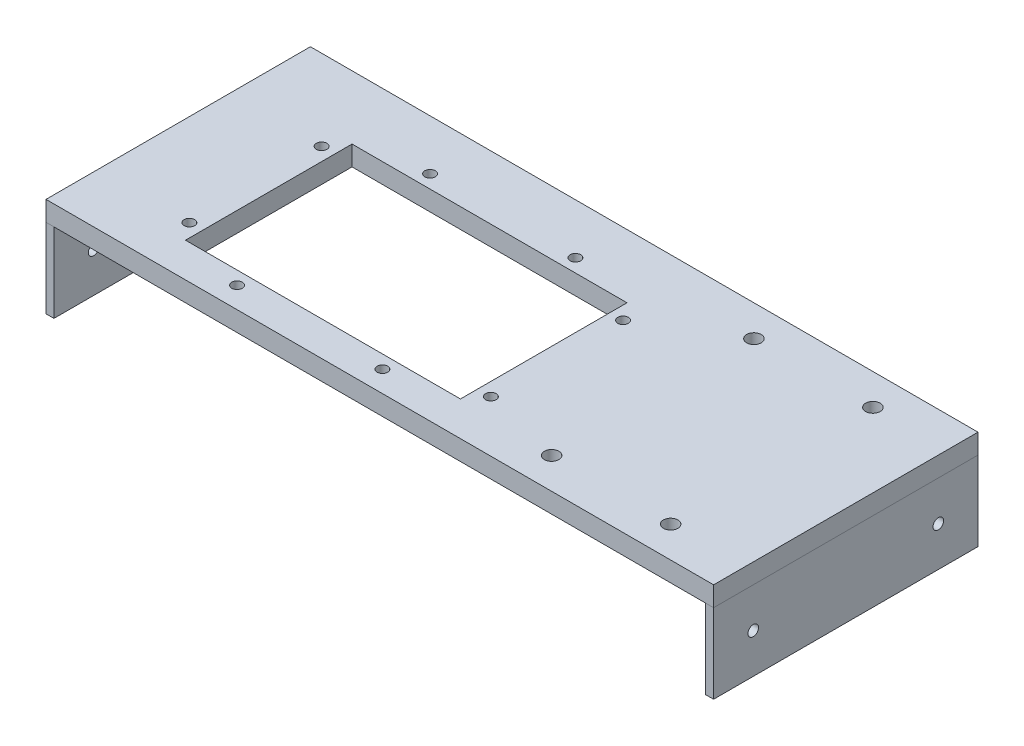
ISO-10303-21;
HEADER;
FILE_DESCRIPTION(('STEP AP214'),'2;1');
FILE_NAME('part.step','',(''),(''),'','','');
FILE_SCHEMA(('AUTOMOTIVE_DESIGN { 1 0 10303 214 1 1 1 1 }'));
ENDSEC;
DATA;
#1=APPLICATION_CONTEXT('core data for automotive mechanical design processes');
#2=APPLICATION_PROTOCOL_DEFINITION('international standard','automotive_design',2000,#1);
#3=PRODUCT_CONTEXT('',#1,'mechanical');
#4=PRODUCT('Part','Part','',(#3));
#5=PRODUCT_RELATED_PRODUCT_CATEGORY('part','',(#4));
#6=PRODUCT_DEFINITION_FORMATION('','',#4);
#7=PRODUCT_DEFINITION_CONTEXT('part definition',#1,'design');
#8=PRODUCT_DEFINITION('design','',#6,#7);
#9=PRODUCT_DEFINITION_SHAPE('','',#8);
#10=(LENGTH_UNIT() NAMED_UNIT(*) SI_UNIT(.MILLI.,.METRE.));
#11=(NAMED_UNIT(*) PLANE_ANGLE_UNIT() SI_UNIT($,.RADIAN.));
#12=(NAMED_UNIT(*) SI_UNIT($,.STERADIAN.) SOLID_ANGLE_UNIT());
#13=UNCERTAINTY_MEASURE_WITH_UNIT(LENGTH_MEASURE(1.E-05),#10,'distance_accuracy_value','');
#14=(GEOMETRIC_REPRESENTATION_CONTEXT(3) GLOBAL_UNCERTAINTY_ASSIGNED_CONTEXT((#13)) GLOBAL_UNIT_ASSIGNED_CONTEXT((#10,
#11,#12)) REPRESENTATION_CONTEXT('',''));
#15=CARTESIAN_POINT('',(0.,0.,0.));
#16=DIRECTION('',(0.,0.,1.));
#17=DIRECTION('',(1.,0.,0.));
#18=AXIS2_PLACEMENT_3D('',#15,#16,#17);
#19=CARTESIAN_POINT('',(252.5,-14.9999999999999,-100.000000000001));
#20=DIRECTION('',(0.,1.,0.));
#21=DIRECTION('',(-1.,0.,0.));
#22=AXIS2_PLACEMENT_3D('',#19,#20,#21);
#23=PLANE('',#22);
#24=DIRECTION('',(-1.,0.,0.));
#25=VECTOR('',#24,1.);
#26=CARTESIAN_POINT('',(252.5,-14.9999999999999,100.000000000001));
#27=LINE('',#26,#25);
#28=CARTESIAN_POINT('',(252.5,-14.9999999999999,100.000000000001));
#29=VERTEX_POINT('',#28);
#30=CARTESIAN_POINT('',(246.5,-14.9999999999999,100.000000000001));
#31=VERTEX_POINT('',#30);
#32=EDGE_CURVE('E114',#29,#31,#27,.T.);
#33=ORIENTED_EDGE('',*,*,#32,.F.);
#34=DIRECTION('',(0.,0.,1.));
#35=VECTOR('',#34,1.);
#36=CARTESIAN_POINT('',(252.5,-14.9999999999999,-100.000000000001));
#37=LINE('',#36,#35);
#38=CARTESIAN_POINT('',(252.5,-14.9999999999999,-100.000000000001));
#39=VERTEX_POINT('',#38);
#40=EDGE_CURVE('E12',#39,#29,#37,.T.);
#41=ORIENTED_EDGE('',*,*,#40,.F.);
#42=DIRECTION('',(-1.,0.,0.));
#43=VECTOR('',#42,1.);
#44=CARTESIAN_POINT('',(252.5,-14.9999999999999,-100.000000000001));
#45=LINE('',#44,#43);
#46=CARTESIAN_POINT('',(246.5,-14.9999999999999,-100.000000000001));
#47=VERTEX_POINT('',#46);
#48=EDGE_CURVE('E107',#39,#47,#45,.T.);
#49=ORIENTED_EDGE('',*,*,#48,.T.);
#50=DIRECTION('',(0.,0.,1.));
#51=VECTOR('',#50,1.);
#52=CARTESIAN_POINT('',(246.5,-14.9999999999999,-100.000000000001));
#53=LINE('',#52,#51);
#54=EDGE_CURVE('E90',#47,#31,#53,.T.);
#55=ORIENTED_EDGE('',*,*,#54,.T.);
#56=EDGE_LOOP('',(#33,#41,#49,#55));
#57=FACE_BOUND('',#56,.T.);
#58=ADVANCED_FACE('F47',(#57),#23,.T.);
#59=CARTESIAN_POINT('',(252.5,-14.9999999999999,-100.000000000001));
#60=DIRECTION('',(1.,0.,0.));
#61=DIRECTION('',(0.,0.,-1.));
#62=AXIS2_PLACEMENT_3D('',#59,#60,#61);
#63=PLANE('',#62);
#64=CARTESIAN_POINT('',(252.5,-45.,70.0000000000006));
#65=DIRECTION('',(-1.,0.,0.));
#66=DIRECTION('',(0.,0.,1.));
#67=AXIS2_PLACEMENT_3D('',#64,#65,#66);
#68=CIRCLE('',#67,4.00000000000001);
#69=CARTESIAN_POINT('',(252.5,-45.,74.0000000000007));
#70=VERTEX_POINT('',#69);
#71=EDGE_CURVE('E125',#70,#70,#68,.T.);
#72=ORIENTED_EDGE('',*,*,#71,.T.);
#73=EDGE_LOOP('',(#72));
#74=FACE_BOUND('',#73,.T.);
#75=CARTESIAN_POINT('',(252.5,-45.,-70.0000000000006));
#76=DIRECTION('',(-1.,0.,0.));
#77=DIRECTION('',(0.,0.,-1.));
#78=AXIS2_PLACEMENT_3D('',#75,#76,#77);
#79=CIRCLE('',#78,4.00000000000001);
#80=CARTESIAN_POINT('',(252.5,-45.,-74.0000000000007));
#81=VERTEX_POINT('',#80);
#82=EDGE_CURVE('E130',#81,#81,#79,.T.);
#83=ORIENTED_EDGE('',*,*,#82,.T.);
#84=EDGE_LOOP('',(#83));
#85=FACE_BOUND('',#84,.T.);
#86=DIRECTION('',(0.,1.,0.));
#87=VECTOR('',#86,1.);
#88=CARTESIAN_POINT('',(252.5,-14.9999999999999,100.000000000001));
#89=LINE('',#88,#87);
#90=CARTESIAN_POINT('',(252.5,-74.9999999999999,100.000000000001));
#91=VERTEX_POINT('',#90);
#92=EDGE_CURVE('E109',#91,#29,#89,.T.);
#93=ORIENTED_EDGE('',*,*,#92,.F.);
#94=DIRECTION('',(0.,0.,1.));
#95=VECTOR('',#94,1.);
#96=CARTESIAN_POINT('',(252.5,-74.9999999999999,-100.000000000001));
#97=LINE('',#96,#95);
#98=CARTESIAN_POINT('',(252.5,-74.9999999999999,-100.000000000001));
#99=VERTEX_POINT('',#98);
#100=EDGE_CURVE('E56',#99,#91,#97,.T.);
#101=ORIENTED_EDGE('',*,*,#100,.F.);
#102=DIRECTION('',(0.,1.,0.));
#103=VECTOR('',#102,1.);
#104=CARTESIAN_POINT('',(252.5,-14.9999999999999,-100.000000000001));
#105=LINE('',#104,#103);
#106=EDGE_CURVE('E104',#99,#39,#105,.T.);
#107=ORIENTED_EDGE('',*,*,#106,.T.);
#108=ORIENTED_EDGE('',*,*,#40,.T.);
#109=EDGE_LOOP('',(#93,#101,#107,#108));
#110=FACE_BOUND('',#109,.T.);
#111=ADVANCED_FACE('F137',(#74,#85,#110),#63,.T.);
#112=CARTESIAN_POINT('',(252.5,-74.9999999999999,-100.000000000001));
#113=DIRECTION('',(0.,-1.,0.));
#114=DIRECTION('',(1.,0.,0.));
#115=AXIS2_PLACEMENT_3D('',#112,#113,#114);
#116=PLANE('',#115);
#117=DIRECTION('',(1.,0.,0.));
#118=VECTOR('',#117,1.);
#119=CARTESIAN_POINT('',(252.5,-74.9999999999999,100.000000000001));
#120=LINE('',#119,#118);
#121=CARTESIAN_POINT('',(246.5,-74.9999999999999,100.000000000001));
#122=VERTEX_POINT('',#121);
#123=EDGE_CURVE('E98',#122,#91,#120,.T.);
#124=ORIENTED_EDGE('',*,*,#123,.F.);
#125=DIRECTION('',(0.,0.,1.));
#126=VECTOR('',#125,1.);
#127=CARTESIAN_POINT('',(246.5,-74.9999999999999,-100.000000000001));
#128=LINE('',#127,#126);
#129=CARTESIAN_POINT('',(246.5,-74.9999999999999,-100.000000000001));
#130=VERTEX_POINT('',#129);
#131=EDGE_CURVE('E93',#130,#122,#128,.T.);
#132=ORIENTED_EDGE('',*,*,#131,.F.);
#133=DIRECTION('',(1.,0.,0.));
#134=VECTOR('',#133,1.);
#135=CARTESIAN_POINT('',(252.5,-74.9999999999999,-100.000000000001));
#136=LINE('',#135,#134);
#137=EDGE_CURVE('E96',#130,#99,#136,.T.);
#138=ORIENTED_EDGE('',*,*,#137,.T.);
#139=ORIENTED_EDGE('',*,*,#100,.T.);
#140=EDGE_LOOP('',(#124,#132,#138,#139));
#141=FACE_BOUND('',#140,.T.);
#142=ADVANCED_FACE('F95',(#141),#116,.T.);
#143=CARTESIAN_POINT('',(246.5,-14.9999999999999,-100.000000000001));
#144=DIRECTION('',(-1.,0.,0.));
#145=DIRECTION('',(0.,0.,1.));
#146=AXIS2_PLACEMENT_3D('',#143,#144,#145);
#147=PLANE('',#146);
#148=CARTESIAN_POINT('',(246.5,-45.,70.0000000000006));
#149=DIRECTION('',(-1.,0.,0.));
#150=DIRECTION('',(0.,0.,1.));
#151=AXIS2_PLACEMENT_3D('',#148,#149,#150);
#152=CIRCLE('',#151,4.00000000000001);
#153=CARTESIAN_POINT('',(246.5,-45.,74.0000000000007));
#154=VERTEX_POINT('',#153);
#155=EDGE_CURVE('E50',#154,#154,#152,.T.);
#156=ORIENTED_EDGE('',*,*,#155,.F.);
#157=EDGE_LOOP('',(#156));
#158=FACE_BOUND('',#157,.T.);
#159=CARTESIAN_POINT('',(246.5,-45.,-70.0000000000006));
#160=DIRECTION('',(-1.,0.,0.));
#161=DIRECTION('',(0.,0.,1.));
#162=AXIS2_PLACEMENT_3D('',#159,#160,#161);
#163=CIRCLE('',#162,4.00000000000001);
#164=CARTESIAN_POINT('',(246.5,-45.,-66.0000000000006));
#165=VERTEX_POINT('',#164);
#166=EDGE_CURVE('E123',#165,#165,#163,.T.);
#167=ORIENTED_EDGE('',*,*,#166,.F.);
#168=EDGE_LOOP('',(#167));
#169=FACE_BOUND('',#168,.T.);
#170=DIRECTION('',(0.,-1.,0.));
#171=VECTOR('',#170,1.);
#172=CARTESIAN_POINT('',(246.5,-14.9999999999999,100.000000000001));
#173=LINE('',#172,#171);
#174=EDGE_CURVE('E117',#31,#122,#173,.T.);
#175=ORIENTED_EDGE('',*,*,#174,.F.);
#176=ORIENTED_EDGE('',*,*,#54,.F.);
#177=DIRECTION('',(0.,-1.,0.));
#178=VECTOR('',#177,1.);
#179=CARTESIAN_POINT('',(246.5,-14.9999999999999,-100.000000000001));
#180=LINE('',#179,#178);
#181=EDGE_CURVE('E103',#47,#130,#180,.T.);
#182=ORIENTED_EDGE('',*,*,#181,.T.);
#183=ORIENTED_EDGE('',*,*,#131,.T.);
#184=EDGE_LOOP('',(#175,#176,#182,#183));
#185=FACE_BOUND('',#184,.T.);
#186=ADVANCED_FACE('F106',(#158,#169,#185),#147,.T.);
#187=CARTESIAN_POINT('',(0.,0.,-100.000000000001));
#188=DIRECTION('',(0.,0.,1.));
#189=DIRECTION('',(1.,0.,0.));
#190=AXIS2_PLACEMENT_3D('',#187,#188,#189);
#191=PLANE('',#190);
#192=ORIENTED_EDGE('',*,*,#48,.F.);
#193=ORIENTED_EDGE('',*,*,#106,.F.);
#194=ORIENTED_EDGE('',*,*,#137,.F.);
#195=ORIENTED_EDGE('',*,*,#181,.F.);
#196=EDGE_LOOP('',(#192,#193,#194,#195));
#197=FACE_BOUND('',#196,.T.);
#198=ADVANCED_FACE('F102',(#197),#191,.F.);
#199=CARTESIAN_POINT('',(0.,0.,100.000000000001));
#200=DIRECTION('',(0.,0.,1.));
#201=DIRECTION('',(1.,0.,0.));
#202=AXIS2_PLACEMENT_3D('',#199,#200,#201);
#203=PLANE('',#202);
#204=ORIENTED_EDGE('',*,*,#32,.T.);
#205=ORIENTED_EDGE('',*,*,#174,.T.);
#206=ORIENTED_EDGE('',*,*,#123,.T.);
#207=ORIENTED_EDGE('',*,*,#92,.T.);
#208=EDGE_LOOP('',(#204,#205,#206,#207));
#209=FACE_BOUND('',#208,.T.);
#210=ADVANCED_FACE('F142',(#209),#203,.T.);
#211=CARTESIAN_POINT('',(252.5,-45.,-70.0000000000006));
#212=DIRECTION('',(-1.,0.,0.));
#213=DIRECTION('',(0.,0.,1.));
#214=AXIS2_PLACEMENT_3D('',#211,#212,#213);
#215=CYLINDRICAL_SURFACE('',#214,4.00000000000001);
#216=ORIENTED_EDGE('',*,*,#166,.T.);
#217=EDGE_LOOP('',(#216));
#218=FACE_BOUND('',#217,.T.);
#219=ORIENTED_EDGE('',*,*,#82,.F.);
#220=EDGE_LOOP('',(#219));
#221=FACE_BOUND('',#220,.T.);
#222=ADVANCED_FACE('F139',(#218,#221),#215,.F.);
#223=CARTESIAN_POINT('',(252.5,-45.,70.0000000000006));
#224=DIRECTION('',(-1.,0.,0.));
#225=DIRECTION('',(0.,0.,1.));
#226=AXIS2_PLACEMENT_3D('',#223,#224,#225);
#227=CYLINDRICAL_SURFACE('',#226,4.00000000000001);
#228=ORIENTED_EDGE('',*,*,#155,.T.);
#229=EDGE_LOOP('',(#228));
#230=FACE_BOUND('',#229,.T.);
#231=ORIENTED_EDGE('',*,*,#71,.F.);
#232=EDGE_LOOP('',(#231));
#233=FACE_BOUND('',#232,.T.);
#234=ADVANCED_FACE('F141',(#230,#233),#227,.F.);
#235=CLOSED_SHELL('',(#58,#111,#142,#186,#198,#210,#222,#234));
#236=MANIFOLD_SOLID_BREP('B2',#235);
#237=CARTESIAN_POINT('',(-252.5,-15.,-100.000000000001));
#238=DIRECTION('',(-1.,0.,0.));
#239=DIRECTION('',(0.,0.,1.));
#240=AXIS2_PLACEMENT_3D('',#237,#238,#239);
#241=PLANE('',#240);
#242=CARTESIAN_POINT('',(-252.5,-45.,70.0000000000006));
#243=DIRECTION('',(-1.,0.,0.));
#244=DIRECTION('',(0.,0.,1.));
#245=AXIS2_PLACEMENT_3D('',#242,#243,#244);
#246=CIRCLE('',#245,4.00000000000001);
#247=CARTESIAN_POINT('',(-252.5,-45.,74.0000000000007));
#248=VERTEX_POINT('',#247);
#249=EDGE_CURVE('E307',#248,#248,#246,.T.);
#250=ORIENTED_EDGE('',*,*,#249,.F.);
#251=EDGE_LOOP('',(#250));
#252=FACE_BOUND('',#251,.T.);
#253=CARTESIAN_POINT('',(-252.5,-45.,-70.0000000000006));
#254=DIRECTION('',(-1.,0.,0.));
#255=DIRECTION('',(0.,0.,-1.));
#256=AXIS2_PLACEMENT_3D('',#253,#254,#255);
#257=CIRCLE('',#256,4.00000000000001);
#258=CARTESIAN_POINT('',(-252.5,-45.,-74.0000000000007));
#259=VERTEX_POINT('',#258);
#260=EDGE_CURVE('E312',#259,#259,#257,.T.);
#261=ORIENTED_EDGE('',*,*,#260,.F.);
#262=EDGE_LOOP('',(#261));
#263=FACE_BOUND('',#262,.T.);
#264=DIRECTION('',(0.,-1.,0.));
#265=VECTOR('',#264,1.);
#266=CARTESIAN_POINT('',(-252.5,-15.,100.000000000001));
#267=LINE('',#266,#265);
#268=CARTESIAN_POINT('',(-252.5,-15.,100.000000000001));
#269=VERTEX_POINT('',#268);
#270=CARTESIAN_POINT('',(-252.5,-75.,100.000000000001));
#271=VERTEX_POINT('',#270);
#272=EDGE_CURVE('E296',#269,#271,#267,.T.);
#273=ORIENTED_EDGE('',*,*,#272,.F.);
#274=DIRECTION('',(0.,0.,1.));
#275=VECTOR('',#274,1.);
#276=CARTESIAN_POINT('',(-252.5,-15.,-100.000000000001));
#277=LINE('',#276,#275);
#278=CARTESIAN_POINT('',(-252.5,-15.,-100.000000000001));
#279=VERTEX_POINT('',#278);
#280=EDGE_CURVE('E45',#279,#269,#277,.T.);
#281=ORIENTED_EDGE('',*,*,#280,.F.);
#282=DIRECTION('',(0.,-1.,0.));
#283=VECTOR('',#282,1.);
#284=CARTESIAN_POINT('',(-252.5,-15.,-100.000000000001));
#285=LINE('',#284,#283);
#286=CARTESIAN_POINT('',(-252.5,-75.,-100.000000000001));
#287=VERTEX_POINT('',#286);
#288=EDGE_CURVE('E289',#279,#287,#285,.T.);
#289=ORIENTED_EDGE('',*,*,#288,.T.);
#290=DIRECTION('',(0.,0.,1.));
#291=VECTOR('',#290,1.);
#292=CARTESIAN_POINT('',(-252.5,-75.,-100.000000000001));
#293=LINE('',#292,#291);
#294=EDGE_CURVE('E272',#287,#271,#293,.T.);
#295=ORIENTED_EDGE('',*,*,#294,.T.);
#296=EDGE_LOOP('',(#273,#281,#289,#295));
#297=FACE_BOUND('',#296,.T.);
#298=ADVANCED_FACE('F229',(#252,#263,#297),#241,.T.);
#299=CARTESIAN_POINT('',(-252.5,-15.,-100.000000000001));
#300=DIRECTION('',(0.,1.,0.));
#301=DIRECTION('',(0.,0.,1.));
#302=AXIS2_PLACEMENT_3D('',#299,#300,#301);
#303=PLANE('',#302);
#304=DIRECTION('',(-1.,0.,0.));
#305=VECTOR('',#304,1.);
#306=CARTESIAN_POINT('',(-252.5,-15.,100.000000000001));
#307=LINE('',#306,#305);
#308=CARTESIAN_POINT('',(-246.5,-15.,100.000000000001));
#309=VERTEX_POINT('',#308);
#310=EDGE_CURVE('E291',#309,#269,#307,.T.);
#311=ORIENTED_EDGE('',*,*,#310,.F.);
#312=DIRECTION('',(0.,0.,1.));
#313=VECTOR('',#312,1.);
#314=CARTESIAN_POINT('',(-246.5,-15.,-100.000000000001));
#315=LINE('',#314,#313);
#316=CARTESIAN_POINT('',(-246.5,-15.,-100.000000000001));
#317=VERTEX_POINT('',#316);
#318=EDGE_CURVE('E238',#317,#309,#315,.T.);
#319=ORIENTED_EDGE('',*,*,#318,.F.);
#320=DIRECTION('',(-1.,0.,0.));
#321=VECTOR('',#320,1.);
#322=CARTESIAN_POINT('',(-252.5,-15.,-100.000000000001));
#323=LINE('',#322,#321);
#324=EDGE_CURVE('E286',#317,#279,#323,.T.);
#325=ORIENTED_EDGE('',*,*,#324,.T.);
#326=ORIENTED_EDGE('',*,*,#280,.T.);
#327=EDGE_LOOP('',(#311,#319,#325,#326));
#328=FACE_BOUND('',#327,.T.);
#329=ADVANCED_FACE('F322',(#328),#303,.T.);
#330=CARTESIAN_POINT('',(-246.5,-15.,-100.000000000001));
#331=DIRECTION('',(1.,0.,0.));
#332=DIRECTION('',(0.,0.,-1.));
#333=AXIS2_PLACEMENT_3D('',#330,#331,#332);
#334=PLANE('',#333);
#335=CARTESIAN_POINT('',(-246.5,-45.,70.0000000000006));
#336=DIRECTION('',(1.,0.,0.));
#337=DIRECTION('',(0.,0.,-1.));
#338=AXIS2_PLACEMENT_3D('',#335,#336,#337);
#339=CIRCLE('',#338,4.00000000000001);
#340=CARTESIAN_POINT('',(-246.5,-45.,66.0000000000006));
#341=VERTEX_POINT('',#340);
#342=EDGE_CURVE('E232',#341,#341,#339,.T.);
#343=ORIENTED_EDGE('',*,*,#342,.F.);
#344=EDGE_LOOP('',(#343));
#345=FACE_BOUND('',#344,.T.);
#346=CARTESIAN_POINT('',(-246.5,-45.,-70.0000000000006));
#347=DIRECTION('',(1.,0.,0.));
#348=DIRECTION('',(0.,0.,-1.));
#349=AXIS2_PLACEMENT_3D('',#346,#347,#348);
#350=CIRCLE('',#349,4.00000000000001);
#351=CARTESIAN_POINT('',(-246.5,-45.,-74.0000000000007));
#352=VERTEX_POINT('',#351);
#353=EDGE_CURVE('E305',#352,#352,#350,.T.);
#354=ORIENTED_EDGE('',*,*,#353,.F.);
#355=EDGE_LOOP('',(#354));
#356=FACE_BOUND('',#355,.T.);
#357=DIRECTION('',(0.,1.,0.));
#358=VECTOR('',#357,1.);
#359=CARTESIAN_POINT('',(-246.5,-15.,100.000000000001));
#360=LINE('',#359,#358);
#361=CARTESIAN_POINT('',(-246.5,-75.,100.000000000001));
#362=VERTEX_POINT('',#361);
#363=EDGE_CURVE('E280',#362,#309,#360,.T.);
#364=ORIENTED_EDGE('',*,*,#363,.F.);
#365=DIRECTION('',(0.,0.,1.));
#366=VECTOR('',#365,1.);
#367=CARTESIAN_POINT('',(-246.5,-75.,-100.000000000001));
#368=LINE('',#367,#366);
#369=CARTESIAN_POINT('',(-246.5,-75.,-100.000000000001));
#370=VERTEX_POINT('',#369);
#371=EDGE_CURVE('E275',#370,#362,#368,.T.);
#372=ORIENTED_EDGE('',*,*,#371,.F.);
#373=DIRECTION('',(0.,1.,0.));
#374=VECTOR('',#373,1.);
#375=CARTESIAN_POINT('',(-246.5,-15.,-100.000000000001));
#376=LINE('',#375,#374);
#377=EDGE_CURVE('E278',#370,#317,#376,.T.);
#378=ORIENTED_EDGE('',*,*,#377,.T.);
#379=ORIENTED_EDGE('',*,*,#318,.T.);
#380=EDGE_LOOP('',(#364,#372,#378,#379));
#381=FACE_BOUND('',#380,.T.);
#382=ADVANCED_FACE('F277',(#345,#356,#381),#334,.T.);
#383=CARTESIAN_POINT('',(-252.5,-75.,-100.000000000001));
#384=DIRECTION('',(0.,-1.,0.));
#385=DIRECTION('',(0.,0.,-1.));
#386=AXIS2_PLACEMENT_3D('',#383,#384,#385);
#387=PLANE('',#386);
#388=DIRECTION('',(1.,0.,0.));
#389=VECTOR('',#388,1.);
#390=CARTESIAN_POINT('',(-252.5,-75.,100.000000000001));
#391=LINE('',#390,#389);
#392=EDGE_CURVE('E299',#271,#362,#391,.T.);
#393=ORIENTED_EDGE('',*,*,#392,.F.);
#394=ORIENTED_EDGE('',*,*,#294,.F.);
#395=DIRECTION('',(1.,0.,0.));
#396=VECTOR('',#395,1.);
#397=CARTESIAN_POINT('',(-252.5,-75.,-100.000000000001));
#398=LINE('',#397,#396);
#399=EDGE_CURVE('E285',#287,#370,#398,.T.);
#400=ORIENTED_EDGE('',*,*,#399,.T.);
#401=ORIENTED_EDGE('',*,*,#371,.T.);
#402=EDGE_LOOP('',(#393,#394,#400,#401));
#403=FACE_BOUND('',#402,.T.);
#404=ADVANCED_FACE('F288',(#403),#387,.T.);
#405=CARTESIAN_POINT('',(0.,0.,-100.000000000001));
#406=DIRECTION('',(0.,0.,1.));
#407=DIRECTION('',(1.,0.,0.));
#408=AXIS2_PLACEMENT_3D('',#405,#406,#407);
#409=PLANE('',#408);
#410=ORIENTED_EDGE('',*,*,#288,.F.);
#411=ORIENTED_EDGE('',*,*,#324,.F.);
#412=ORIENTED_EDGE('',*,*,#377,.F.);
#413=ORIENTED_EDGE('',*,*,#399,.F.);
#414=EDGE_LOOP('',(#410,#411,#412,#413));
#415=FACE_BOUND('',#414,.T.);
#416=ADVANCED_FACE('F284',(#415),#409,.F.);
#417=CARTESIAN_POINT('',(0.,0.,100.000000000001));
#418=DIRECTION('',(0.,0.,1.));
#419=DIRECTION('',(1.,0.,0.));
#420=AXIS2_PLACEMENT_3D('',#417,#418,#419);
#421=PLANE('',#420);
#422=ORIENTED_EDGE('',*,*,#272,.T.);
#423=ORIENTED_EDGE('',*,*,#392,.T.);
#424=ORIENTED_EDGE('',*,*,#363,.T.);
#425=ORIENTED_EDGE('',*,*,#310,.T.);
#426=EDGE_LOOP('',(#422,#423,#424,#425));
#427=FACE_BOUND('',#426,.T.);
#428=ADVANCED_FACE('F325',(#427),#421,.T.);
#429=CARTESIAN_POINT('',(252.5,-45.,-70.0000000000006));
#430=DIRECTION('',(-1.,0.,0.));
#431=DIRECTION('',(0.,0.,1.));
#432=AXIS2_PLACEMENT_3D('',#429,#430,#431);
#433=CYLINDRICAL_SURFACE('',#432,4.00000000000001);
#434=ORIENTED_EDGE('',*,*,#353,.T.);
#435=EDGE_LOOP('',(#434));
#436=FACE_BOUND('',#435,.T.);
#437=ORIENTED_EDGE('',*,*,#260,.T.);
#438=EDGE_LOOP('',(#437));
#439=FACE_BOUND('',#438,.T.);
#440=ADVANCED_FACE('F319',(#436,#439),#433,.F.);
#441=CARTESIAN_POINT('',(252.5,-45.,70.0000000000006));
#442=DIRECTION('',(-1.,0.,0.));
#443=DIRECTION('',(0.,0.,1.));
#444=AXIS2_PLACEMENT_3D('',#441,#442,#443);
#445=CYLINDRICAL_SURFACE('',#444,4.00000000000001);
#446=ORIENTED_EDGE('',*,*,#342,.T.);
#447=EDGE_LOOP('',(#446));
#448=FACE_BOUND('',#447,.T.);
#449=ORIENTED_EDGE('',*,*,#249,.T.);
#450=EDGE_LOOP('',(#449));
#451=FACE_BOUND('',#450,.T.);
#452=ADVANCED_FACE('F345',(#448,#451),#445,.F.);
#453=CLOSED_SHELL('',(#298,#329,#382,#404,#416,#428,#440,#452));
#454=MANIFOLD_SOLID_BREP('B6',#453);
#455=CARTESIAN_POINT('',(252.5,-15.,100.000000000001));
#456=DIRECTION('',(1.,0.,0.));
#457=DIRECTION('',(0.,0.,-1.));
#458=AXIS2_PLACEMENT_3D('',#455,#456,#457);
#459=PLANE('',#458);
#460=DIRECTION('',(0.,0.,-1.));
#461=VECTOR('',#460,1.);
#462=CARTESIAN_POINT('',(252.5,0.,100.000000000001));
#463=LINE('',#462,#461);
#464=CARTESIAN_POINT('',(252.5,0.,100.000000000001));
#465=VERTEX_POINT('',#464);
#466=CARTESIAN_POINT('',(252.5,0.,-100.000000000001));
#467=VERTEX_POINT('',#466);
#468=EDGE_CURVE('E573',#465,#467,#463,.T.);
#469=ORIENTED_EDGE('',*,*,#468,.F.);
#470=DIRECTION('',(0.,1.,0.));
#471=VECTOR('',#470,1.);
#472=CARTESIAN_POINT('',(252.5,-15.,100.000000000001));
#473=LINE('',#472,#471);
#474=CARTESIAN_POINT('',(252.5,-15.,100.000000000001));
#475=VERTEX_POINT('',#474);
#476=EDGE_CURVE('E227',#475,#465,#473,.T.);
#477=ORIENTED_EDGE('',*,*,#476,.F.);
#478=DIRECTION('',(0.,0.,-1.));
#479=VECTOR('',#478,1.);
#480=CARTESIAN_POINT('',(252.5,-15.,100.000000000001));
#481=LINE('',#480,#479);
#482=CARTESIAN_POINT('',(252.5,-15.,-100.000000000001));
#483=VERTEX_POINT('',#482);
#484=EDGE_CURVE('E576',#475,#483,#481,.T.);
#485=ORIENTED_EDGE('',*,*,#484,.T.);
#486=DIRECTION('',(0.,1.,0.));
#487=VECTOR('',#486,1.);
#488=CARTESIAN_POINT('',(252.5,-15.,-100.000000000001));
#489=LINE('',#488,#487);
#490=EDGE_CURVE('E405',#483,#467,#489,.T.);
#491=ORIENTED_EDGE('',*,*,#490,.T.);
#492=EDGE_LOOP('',(#469,#477,#485,#491));
#493=FACE_BOUND('',#492,.T.);
#494=ADVANCED_FACE('F402',(#493),#459,.T.);
#495=CARTESIAN_POINT('',(-252.5,-15.,100.000000000001));
#496=DIRECTION('',(0.,0.,1.));
#497=DIRECTION('',(1.,0.,0.));
#498=AXIS2_PLACEMENT_3D('',#495,#496,#497);
#499=PLANE('',#498);
#500=DIRECTION('',(1.,0.,0.));
#501=VECTOR('',#500,1.);
#502=CARTESIAN_POINT('',(-252.5,0.,100.000000000001));
#503=LINE('',#502,#501);
#504=CARTESIAN_POINT('',(-252.5,0.,100.000000000001));
#505=VERTEX_POINT('',#504);
#506=EDGE_CURVE('E580',#505,#465,#503,.T.);
#507=ORIENTED_EDGE('',*,*,#506,.F.);
#508=DIRECTION('',(0.,1.,0.));
#509=VECTOR('',#508,1.);
#510=CARTESIAN_POINT('',(-252.5,-15.,100.000000000001));
#511=LINE('',#510,#509);
#512=CARTESIAN_POINT('',(-252.5,-15.,100.000000000001));
#513=VERTEX_POINT('',#512);
#514=EDGE_CURVE('E410',#513,#505,#511,.T.);
#515=ORIENTED_EDGE('',*,*,#514,.F.);
#516=DIRECTION('',(1.,0.,0.));
#517=VECTOR('',#516,1.);
#518=CARTESIAN_POINT('',(-252.5,-15.,100.000000000001));
#519=LINE('',#518,#517);
#520=EDGE_CURVE('E586',#513,#475,#519,.T.);
#521=ORIENTED_EDGE('',*,*,#520,.T.);
#522=ORIENTED_EDGE('',*,*,#476,.T.);
#523=EDGE_LOOP('',(#507,#515,#521,#522));
#524=FACE_BOUND('',#523,.T.);
#525=ADVANCED_FACE('F611',(#524),#499,.T.);
#526=CARTESIAN_POINT('',(-252.5,-15.,-100.000000000001));
#527=DIRECTION('',(-1.,0.,0.));
#528=DIRECTION('',(0.,0.,1.));
#529=AXIS2_PLACEMENT_3D('',#526,#527,#528);
#530=PLANE('',#529);
#531=DIRECTION('',(0.,0.,1.));
#532=VECTOR('',#531,1.);
#533=CARTESIAN_POINT('',(-252.5,0.,-100.000000000001));
#534=LINE('',#533,#532);
#535=CARTESIAN_POINT('',(-252.5,0.,-100.000000000001));
#536=VERTEX_POINT('',#535);
#537=EDGE_CURVE('E594',#536,#505,#534,.T.);
#538=ORIENTED_EDGE('',*,*,#537,.F.);
#539=DIRECTION('',(0.,1.,0.));
#540=VECTOR('',#539,1.);
#541=CARTESIAN_POINT('',(-252.5,-15.,-100.000000000001));
#542=LINE('',#541,#540);
#543=CARTESIAN_POINT('',(-252.5,-15.,-100.000000000001));
#544=VERTEX_POINT('',#543);
#545=EDGE_CURVE('E599',#544,#536,#542,.T.);
#546=ORIENTED_EDGE('',*,*,#545,.F.);
#547=DIRECTION('',(0.,0.,1.));
#548=VECTOR('',#547,1.);
#549=CARTESIAN_POINT('',(-252.5,-15.,-100.000000000001));
#550=LINE('',#549,#548);
#551=EDGE_CURVE('E583',#544,#513,#550,.T.);
#552=ORIENTED_EDGE('',*,*,#551,.T.);
#553=ORIENTED_EDGE('',*,*,#514,.T.);
#554=EDGE_LOOP('',(#538,#546,#552,#553));
#555=FACE_BOUND('',#554,.T.);
#556=ADVANCED_FACE('F617',(#555),#530,.T.);
#557=CARTESIAN_POINT('',(252.5,-15.,-100.000000000001));
#558=DIRECTION('',(0.,0.,-1.));
#559=DIRECTION('',(-1.,0.,0.));
#560=AXIS2_PLACEMENT_3D('',#557,#558,#559);
#561=PLANE('',#560);
#562=DIRECTION('',(-1.,0.,0.));
#563=VECTOR('',#562,1.);
#564=CARTESIAN_POINT('',(252.5,0.,-100.000000000001));
#565=LINE('',#564,#563);
#566=EDGE_CURVE('E591',#467,#536,#565,.T.);
#567=ORIENTED_EDGE('',*,*,#566,.F.);
#568=ORIENTED_EDGE('',*,*,#490,.F.);
#569=DIRECTION('',(-1.,0.,0.));
#570=VECTOR('',#569,1.);
#571=CARTESIAN_POINT('',(252.5,-15.,-100.000000000001));
#572=LINE('',#571,#570);
#573=EDGE_CURVE('E579',#483,#544,#572,.T.);
#574=ORIENTED_EDGE('',*,*,#573,.T.);
#575=ORIENTED_EDGE('',*,*,#545,.T.);
#576=EDGE_LOOP('',(#567,#568,#574,#575));
#577=FACE_BOUND('',#576,.T.);
#578=ADVANCED_FACE('F607',(#577),#561,.T.);
#579=CARTESIAN_POINT('',(0.,-15.,0.));
#580=DIRECTION('',(0.,1.,0.));
#581=DIRECTION('',(0.,0.,1.));
#582=AXIS2_PLACEMENT_3D('',#579,#580,#581);
#583=PLANE('',#582);
#584=DIRECTION('',(1.,0.,0.));
#585=VECTOR('',#584,1.);
#586=CARTESIAN_POINT('',(-173.,-15.,-52.));
#587=LINE('',#586,#585);
#588=CARTESIAN_POINT('',(-173.,-15.,-52.));
#589=VERTEX_POINT('',#588);
#590=CARTESIAN_POINT('',(35.0000000000001,-15.,-52.0000000000001));
#591=VERTEX_POINT('',#590);
#592=EDGE_CURVE('E494',#589,#591,#587,.T.);
#593=ORIENTED_EDGE('',*,*,#592,.F.);
#594=DIRECTION('',(0.,0.,-1.));
#595=VECTOR('',#594,1.);
#596=CARTESIAN_POINT('',(-173.,-15.,74.0000000000002));
#597=LINE('',#596,#595);
#598=CARTESIAN_POINT('',(-173.,-15.,74.0000000000002));
#599=VERTEX_POINT('',#598);
#600=EDGE_CURVE('E418',#599,#589,#597,.T.);
#601=ORIENTED_EDGE('',*,*,#600,.F.);
#602=DIRECTION('',(-1.,0.,0.));
#603=VECTOR('',#602,1.);
#604=CARTESIAN_POINT('',(-173.,-15.,74.0000000000002));
#605=LINE('',#604,#603);
#606=CARTESIAN_POINT('',(35.0000000000001,-15.,74.0000000000002));
#607=VERTEX_POINT('',#606);
#608=EDGE_CURVE('E485',#607,#599,#605,.T.);
#609=ORIENTED_EDGE('',*,*,#608,.F.);
#610=DIRECTION('',(0.,0.,1.));
#611=VECTOR('',#610,1.);
#612=CARTESIAN_POINT('',(35.0000000000001,-15.,74.0000000000002));
#613=LINE('',#612,#611);
#614=EDGE_CURVE('E488',#591,#607,#613,.T.);
#615=ORIENTED_EDGE('',*,*,#614,.F.);
#616=EDGE_LOOP('',(#593,#601,#609,#615));
#617=FACE_BOUND('',#616,.T.);
#618=CARTESIAN_POINT('',(-13.9999999999999,-15.,-62.));
#619=DIRECTION('',(0.,1.,0.));
#620=DIRECTION('',(0.,0.,1.));
#621=AXIS2_PLACEMENT_3D('',#618,#619,#620);
#622=CIRCLE('',#621,4.);
#623=CARTESIAN_POINT('',(-13.9999999999999,-15.,-58.));
#624=VERTEX_POINT('',#623);
#625=EDGE_CURVE('E504',#624,#624,#622,.T.);
#626=ORIENTED_EDGE('',*,*,#625,.T.);
#627=EDGE_LOOP('',(#626));
#628=FACE_BOUND('',#627,.T.);
#629=CARTESIAN_POINT('',(45.0000000000001,-15.,-39.));
#630=DIRECTION('',(0.,1.,0.));
#631=DIRECTION('',(0.,0.,1.));
#632=AXIS2_PLACEMENT_3D('',#629,#630,#631);
#633=CIRCLE('',#632,4.00000000000001);
#634=CARTESIAN_POINT('',(45.0000000000001,-15.,-35.));
#635=VERTEX_POINT('',#634);
#636=EDGE_CURVE('E510',#635,#635,#633,.T.);
#637=ORIENTED_EDGE('',*,*,#636,.T.);
#638=EDGE_LOOP('',(#637));
#639=FACE_BOUND('',#638,.T.);
#640=CARTESIAN_POINT('',(-124.,-15.,-62.));
#641=DIRECTION('',(0.,1.,0.));
#642=DIRECTION('',(0.,0.,1.));
#643=AXIS2_PLACEMENT_3D('',#640,#641,#642);
#644=CIRCLE('',#643,4.00000000000001);
#645=CARTESIAN_POINT('',(-124.,-15.,-58.));
#646=VERTEX_POINT('',#645);
#647=EDGE_CURVE('E516',#646,#646,#644,.T.);
#648=ORIENTED_EDGE('',*,*,#647,.T.);
#649=EDGE_LOOP('',(#648));
#650=FACE_BOUND('',#649,.T.);
#651=CARTESIAN_POINT('',(-183.,-15.,-39.));
#652=DIRECTION('',(0.,1.,0.));
#653=DIRECTION('',(0.,0.,1.));
#654=AXIS2_PLACEMENT_3D('',#651,#652,#653);
#655=CIRCLE('',#654,3.99999999999999);
#656=CARTESIAN_POINT('',(-183.,-15.,-35.));
#657=VERTEX_POINT('',#656);
#658=EDGE_CURVE('E522',#657,#657,#655,.T.);
#659=ORIENTED_EDGE('',*,*,#658,.T.);
#660=EDGE_LOOP('',(#659));
#661=FACE_BOUND('',#660,.T.);
#662=CARTESIAN_POINT('',(-183.,-15.,61.));
#663=DIRECTION('',(0.,1.,0.));
#664=DIRECTION('',(0.,0.,1.));
#665=AXIS2_PLACEMENT_3D('',#662,#663,#664);
#666=CIRCLE('',#665,3.99999999999999);
#667=CARTESIAN_POINT('',(-183.,-15.,65.));
#668=VERTEX_POINT('',#667);
#669=EDGE_CURVE('E528',#668,#668,#666,.T.);
#670=ORIENTED_EDGE('',*,*,#669,.T.);
#671=EDGE_LOOP('',(#670));
#672=FACE_BOUND('',#671,.T.);
#673=CARTESIAN_POINT('',(-124.,-15.,84.0000000000001));
#674=DIRECTION('',(0.,1.,0.));
#675=DIRECTION('',(0.,0.,1.));
#676=AXIS2_PLACEMENT_3D('',#673,#674,#675);
#677=CIRCLE('',#676,4.00000000000001);
#678=CARTESIAN_POINT('',(-124.,-15.,88.0000000000001));
#679=VERTEX_POINT('',#678);
#680=EDGE_CURVE('E534',#679,#679,#677,.T.);
#681=ORIENTED_EDGE('',*,*,#680,.T.);
#682=EDGE_LOOP('',(#681));
#683=FACE_BOUND('',#682,.T.);
#684=CARTESIAN_POINT('',(106.5,-15.,-76.5));
#685=DIRECTION('',(0.,1.,0.));
#686=DIRECTION('',(0.,0.,1.));
#687=AXIS2_PLACEMENT_3D('',#684,#685,#686);
#688=CIRCLE('',#687,5.50000000000001);
#689=CARTESIAN_POINT('',(106.5,-15.,-71.));
#690=VERTEX_POINT('',#689);
#691=EDGE_CURVE('E540',#690,#690,#688,.T.);
#692=ORIENTED_EDGE('',*,*,#691,.T.);
#693=EDGE_LOOP('',(#692));
#694=FACE_BOUND('',#693,.T.);
#695=CARTESIAN_POINT('',(196.5,-15.,-76.5));
#696=DIRECTION('',(0.,1.,0.));
#697=DIRECTION('',(0.,0.,1.));
#698=AXIS2_PLACEMENT_3D('',#695,#696,#697);
#699=CIRCLE('',#698,5.50000000000001);
#700=CARTESIAN_POINT('',(196.5,-15.,-71.));
#701=VERTEX_POINT('',#700);
#702=EDGE_CURVE('E546',#701,#701,#699,.T.);
#703=ORIENTED_EDGE('',*,*,#702,.T.);
#704=EDGE_LOOP('',(#703));
#705=FACE_BOUND('',#704,.T.);
#706=CARTESIAN_POINT('',(196.5,-15.,76.5));
#707=DIRECTION('',(0.,1.,0.));
#708=DIRECTION('',(0.,0.,1.));
#709=AXIS2_PLACEMENT_3D('',#706,#707,#708);
#710=CIRCLE('',#709,5.50000000000001);
#711=CARTESIAN_POINT('',(196.5,-15.,82.));
#712=VERTEX_POINT('',#711);
#713=EDGE_CURVE('E552',#712,#712,#710,.T.);
#714=ORIENTED_EDGE('',*,*,#713,.T.);
#715=EDGE_LOOP('',(#714));
#716=FACE_BOUND('',#715,.T.);
#717=CARTESIAN_POINT('',(106.5,-15.,76.5000000000001));
#718=DIRECTION('',(0.,1.,0.));
#719=DIRECTION('',(0.,0.,1.));
#720=AXIS2_PLACEMENT_3D('',#717,#718,#719);
#721=CIRCLE('',#720,5.50000000000001);
#722=CARTESIAN_POINT('',(106.5,-15.,82.0000000000001));
#723=VERTEX_POINT('',#722);
#724=EDGE_CURVE('E558',#723,#723,#721,.T.);
#725=ORIENTED_EDGE('',*,*,#724,.T.);
#726=EDGE_LOOP('',(#725));
#727=FACE_BOUND('',#726,.T.);
#728=CARTESIAN_POINT('',(-13.9999999999999,-15.,84.0000000000001));
#729=DIRECTION('',(0.,1.,0.));
#730=DIRECTION('',(0.,0.,1.));
#731=AXIS2_PLACEMENT_3D('',#728,#729,#730);
#732=CIRCLE('',#731,4.);
#733=CARTESIAN_POINT('',(-13.9999999999999,-15.,88.0000000000001));
#734=VERTEX_POINT('',#733);
#735=EDGE_CURVE('E564',#734,#734,#732,.T.);
#736=ORIENTED_EDGE('',*,*,#735,.T.);
#737=EDGE_LOOP('',(#736));
#738=FACE_BOUND('',#737,.T.);
#739=CARTESIAN_POINT('',(45.0000000000001,-15.,61.));
#740=DIRECTION('',(0.,1.,0.));
#741=DIRECTION('',(0.,0.,1.));
#742=AXIS2_PLACEMENT_3D('',#739,#740,#741);
#743=CIRCLE('',#742,4.00000000000001);
#744=CARTESIAN_POINT('',(45.0000000000001,-15.,65.));
#745=VERTEX_POINT('',#744);
#746=EDGE_CURVE('E570',#745,#745,#743,.T.);
#747=ORIENTED_EDGE('',*,*,#746,.T.);
#748=EDGE_LOOP('',(#747));
#749=FACE_BOUND('',#748,.T.);
#750=ORIENTED_EDGE('',*,*,#484,.F.);
#751=ORIENTED_EDGE('',*,*,#520,.F.);
#752=ORIENTED_EDGE('',*,*,#551,.F.);
#753=ORIENTED_EDGE('',*,*,#573,.F.);
#754=EDGE_LOOP('',(#750,#751,#752,#753));
#755=FACE_BOUND('',#754,.T.);
#756=ADVANCED_FACE('F614',(#617,#628,#639,#650,#661,#672,#683,#694,#705,#716,#727,#738,#749,
#755),#583,.F.);
#757=CARTESIAN_POINT('',(0.,0.,0.));
#758=DIRECTION('',(0.,1.,0.));
#759=DIRECTION('',(0.,0.,1.));
#760=AXIS2_PLACEMENT_3D('',#757,#758,#759);
#761=PLANE('',#760);
#762=DIRECTION('',(0.,0.,-1.));
#763=VECTOR('',#762,1.);
#764=CARTESIAN_POINT('',(-173.,0.,74.0000000000002));
#765=LINE('',#764,#763);
#766=CARTESIAN_POINT('',(-173.,0.,74.0000000000002));
#767=VERTEX_POINT('',#766);
#768=CARTESIAN_POINT('',(-173.,0.,-52.));
#769=VERTEX_POINT('',#768);
#770=EDGE_CURVE('E469',#767,#769,#765,.T.);
#771=ORIENTED_EDGE('',*,*,#770,.T.);
#772=DIRECTION('',(1.,0.,0.));
#773=VECTOR('',#772,1.);
#774=CARTESIAN_POINT('',(-173.,0.,-52.));
#775=LINE('',#774,#773);
#776=CARTESIAN_POINT('',(35.0000000000001,0.,-52.0000000000001));
#777=VERTEX_POINT('',#776);
#778=EDGE_CURVE('E478',#769,#777,#775,.T.);
#779=ORIENTED_EDGE('',*,*,#778,.T.);
#780=DIRECTION('',(0.,0.,1.));
#781=VECTOR('',#780,1.);
#782=CARTESIAN_POINT('',(35.0000000000001,0.,74.0000000000002));
#783=LINE('',#782,#781);
#784=CARTESIAN_POINT('',(35.0000000000001,0.,74.0000000000002));
#785=VERTEX_POINT('',#784);
#786=EDGE_CURVE('E426',#777,#785,#783,.T.);
#787=ORIENTED_EDGE('',*,*,#786,.T.);
#788=DIRECTION('',(-1.,0.,0.));
#789=VECTOR('',#788,1.);
#790=CARTESIAN_POINT('',(-173.,0.,74.0000000000002));
#791=LINE('',#790,#789);
#792=EDGE_CURVE('E475',#785,#767,#791,.T.);
#793=ORIENTED_EDGE('',*,*,#792,.T.);
#794=EDGE_LOOP('',(#771,#779,#787,#793));
#795=FACE_BOUND('',#794,.T.);
#796=CARTESIAN_POINT('',(-13.9999999999999,0.,-62.));
#797=DIRECTION('',(0.,1.,0.));
#798=DIRECTION('',(0.,0.,1.));
#799=AXIS2_PLACEMENT_3D('',#796,#797,#798);
#800=CIRCLE('',#799,4.);
#801=CARTESIAN_POINT('',(-13.9999999999999,0.,-58.));
#802=VERTEX_POINT('',#801);
#803=EDGE_CURVE('E500',#802,#802,#800,.T.);
#804=ORIENTED_EDGE('',*,*,#803,.F.);
#805=EDGE_LOOP('',(#804));
#806=FACE_BOUND('',#805,.T.);
#807=CARTESIAN_POINT('',(45.0000000000001,0.,-39.));
#808=DIRECTION('',(0.,1.,0.));
#809=DIRECTION('',(0.,0.,1.));
#810=AXIS2_PLACEMENT_3D('',#807,#808,#809);
#811=CIRCLE('',#810,4.00000000000001);
#812=CARTESIAN_POINT('',(45.0000000000001,0.,-35.));
#813=VERTEX_POINT('',#812);
#814=EDGE_CURVE('E507',#813,#813,#811,.T.);
#815=ORIENTED_EDGE('',*,*,#814,.F.);
#816=EDGE_LOOP('',(#815));
#817=FACE_BOUND('',#816,.T.);
#818=CARTESIAN_POINT('',(-124.,0.,-62.));
#819=DIRECTION('',(0.,1.,0.));
#820=DIRECTION('',(0.,0.,1.));
#821=AXIS2_PLACEMENT_3D('',#818,#819,#820);
#822=CIRCLE('',#821,4.00000000000001);
#823=CARTESIAN_POINT('',(-124.,0.,-58.));
#824=VERTEX_POINT('',#823);
#825=EDGE_CURVE('E513',#824,#824,#822,.T.);
#826=ORIENTED_EDGE('',*,*,#825,.F.);
#827=EDGE_LOOP('',(#826));
#828=FACE_BOUND('',#827,.T.);
#829=CARTESIAN_POINT('',(-183.,0.,-39.));
#830=DIRECTION('',(0.,1.,0.));
#831=DIRECTION('',(0.,0.,1.));
#832=AXIS2_PLACEMENT_3D('',#829,#830,#831);
#833=CIRCLE('',#832,3.99999999999999);
#834=CARTESIAN_POINT('',(-183.,0.,-35.));
#835=VERTEX_POINT('',#834);
#836=EDGE_CURVE('E519',#835,#835,#833,.T.);
#837=ORIENTED_EDGE('',*,*,#836,.F.);
#838=EDGE_LOOP('',(#837));
#839=FACE_BOUND('',#838,.T.);
#840=CARTESIAN_POINT('',(-183.,0.,61.));
#841=DIRECTION('',(0.,1.,0.));
#842=DIRECTION('',(0.,0.,1.));
#843=AXIS2_PLACEMENT_3D('',#840,#841,#842);
#844=CIRCLE('',#843,3.99999999999999);
#845=CARTESIAN_POINT('',(-183.,0.,65.));
#846=VERTEX_POINT('',#845);
#847=EDGE_CURVE('E525',#846,#846,#844,.T.);
#848=ORIENTED_EDGE('',*,*,#847,.F.);
#849=EDGE_LOOP('',(#848));
#850=FACE_BOUND('',#849,.T.);
#851=CARTESIAN_POINT('',(-124.,0.,84.0000000000001));
#852=DIRECTION('',(0.,1.,0.));
#853=DIRECTION('',(0.,0.,1.));
#854=AXIS2_PLACEMENT_3D('',#851,#852,#853);
#855=CIRCLE('',#854,4.00000000000001);
#856=CARTESIAN_POINT('',(-124.,0.,88.0000000000001));
#857=VERTEX_POINT('',#856);
#858=EDGE_CURVE('E531',#857,#857,#855,.T.);
#859=ORIENTED_EDGE('',*,*,#858,.F.);
#860=EDGE_LOOP('',(#859));
#861=FACE_BOUND('',#860,.T.);
#862=CARTESIAN_POINT('',(106.5,0.,-76.5));
#863=DIRECTION('',(0.,1.,0.));
#864=DIRECTION('',(0.,0.,1.));
#865=AXIS2_PLACEMENT_3D('',#862,#863,#864);
#866=CIRCLE('',#865,5.50000000000001);
#867=CARTESIAN_POINT('',(106.5,0.,-71.));
#868=VERTEX_POINT('',#867);
#869=EDGE_CURVE('E537',#868,#868,#866,.T.);
#870=ORIENTED_EDGE('',*,*,#869,.F.);
#871=EDGE_LOOP('',(#870));
#872=FACE_BOUND('',#871,.T.);
#873=CARTESIAN_POINT('',(196.5,0.,-76.5));
#874=DIRECTION('',(0.,1.,0.));
#875=DIRECTION('',(0.,0.,1.));
#876=AXIS2_PLACEMENT_3D('',#873,#874,#875);
#877=CIRCLE('',#876,5.50000000000001);
#878=CARTESIAN_POINT('',(196.5,0.,-71.));
#879=VERTEX_POINT('',#878);
#880=EDGE_CURVE('E543',#879,#879,#877,.T.);
#881=ORIENTED_EDGE('',*,*,#880,.F.);
#882=EDGE_LOOP('',(#881));
#883=FACE_BOUND('',#882,.T.);
#884=CARTESIAN_POINT('',(196.5,0.,76.5));
#885=DIRECTION('',(0.,1.,0.));
#886=DIRECTION('',(0.,0.,1.));
#887=AXIS2_PLACEMENT_3D('',#884,#885,#886);
#888=CIRCLE('',#887,5.50000000000001);
#889=CARTESIAN_POINT('',(196.5,0.,82.));
#890=VERTEX_POINT('',#889);
#891=EDGE_CURVE('E549',#890,#890,#888,.T.);
#892=ORIENTED_EDGE('',*,*,#891,.F.);
#893=EDGE_LOOP('',(#892));
#894=FACE_BOUND('',#893,.T.);
#895=CARTESIAN_POINT('',(106.5,0.,76.5000000000001));
#896=DIRECTION('',(0.,1.,0.));
#897=DIRECTION('',(0.,0.,1.));
#898=AXIS2_PLACEMENT_3D('',#895,#896,#897);
#899=CIRCLE('',#898,5.50000000000001);
#900=CARTESIAN_POINT('',(106.5,0.,82.0000000000001));
#901=VERTEX_POINT('',#900);
#902=EDGE_CURVE('E555',#901,#901,#899,.T.);
#903=ORIENTED_EDGE('',*,*,#902,.F.);
#904=EDGE_LOOP('',(#903));
#905=FACE_BOUND('',#904,.T.);
#906=CARTESIAN_POINT('',(-13.9999999999999,0.,84.0000000000001));
#907=DIRECTION('',(0.,1.,0.));
#908=DIRECTION('',(0.,0.,1.));
#909=AXIS2_PLACEMENT_3D('',#906,#907,#908);
#910=CIRCLE('',#909,4.);
#911=CARTESIAN_POINT('',(-13.9999999999999,0.,88.0000000000001));
#912=VERTEX_POINT('',#911);
#913=EDGE_CURVE('E561',#912,#912,#910,.T.);
#914=ORIENTED_EDGE('',*,*,#913,.F.);
#915=EDGE_LOOP('',(#914));
#916=FACE_BOUND('',#915,.T.);
#917=CARTESIAN_POINT('',(45.0000000000001,0.,61.));
#918=DIRECTION('',(0.,1.,0.));
#919=DIRECTION('',(0.,0.,1.));
#920=AXIS2_PLACEMENT_3D('',#917,#918,#919);
#921=CIRCLE('',#920,4.00000000000001);
#922=CARTESIAN_POINT('',(45.0000000000001,0.,65.));
#923=VERTEX_POINT('',#922);
#924=EDGE_CURVE('E567',#923,#923,#921,.T.);
#925=ORIENTED_EDGE('',*,*,#924,.F.);
#926=EDGE_LOOP('',(#925));
#927=FACE_BOUND('',#926,.T.);
#928=ORIENTED_EDGE('',*,*,#468,.T.);
#929=ORIENTED_EDGE('',*,*,#566,.T.);
#930=ORIENTED_EDGE('',*,*,#537,.T.);
#931=ORIENTED_EDGE('',*,*,#506,.T.);
#932=EDGE_LOOP('',(#928,#929,#930,#931));
#933=FACE_BOUND('',#932,.T.);
#934=ADVANCED_FACE('F482',(#795,#806,#817,#828,#839,#850,#861,#872,#883,#894,#905,#916,#927,
#933),#761,.T.);
#935=CARTESIAN_POINT('',(45.0000000000001,-15.,61.));
#936=DIRECTION('',(0.,1.,0.));
#937=DIRECTION('',(0.,0.,1.));
#938=AXIS2_PLACEMENT_3D('',#935,#936,#937);
#939=CYLINDRICAL_SURFACE('',#938,4.00000000000001);
#940=ORIENTED_EDGE('',*,*,#746,.F.);
#941=EDGE_LOOP('',(#940));
#942=FACE_BOUND('',#941,.T.);
#943=ORIENTED_EDGE('',*,*,#924,.T.);
#944=EDGE_LOOP('',(#943));
#945=FACE_BOUND('',#944,.T.);
#946=ADVANCED_FACE('F656',(#942,#945),#939,.F.);
#947=CARTESIAN_POINT('',(-13.9999999999999,-15.,84.0000000000001));
#948=DIRECTION('',(0.,1.,0.));
#949=DIRECTION('',(0.,0.,1.));
#950=AXIS2_PLACEMENT_3D('',#947,#948,#949);
#951=CYLINDRICAL_SURFACE('',#950,4.);
#952=ORIENTED_EDGE('',*,*,#735,.F.);
#953=EDGE_LOOP('',(#952));
#954=FACE_BOUND('',#953,.T.);
#955=ORIENTED_EDGE('',*,*,#913,.T.);
#956=EDGE_LOOP('',(#955));
#957=FACE_BOUND('',#956,.T.);
#958=ADVANCED_FACE('F664',(#954,#957),#951,.F.);
#959=CARTESIAN_POINT('',(106.5,-15.,76.5000000000001));
#960=DIRECTION('',(0.,1.,0.));
#961=DIRECTION('',(0.,0.,1.));
#962=AXIS2_PLACEMENT_3D('',#959,#960,#961);
#963=CYLINDRICAL_SURFACE('',#962,5.50000000000001);
#964=ORIENTED_EDGE('',*,*,#724,.F.);
#965=EDGE_LOOP('',(#964));
#966=FACE_BOUND('',#965,.T.);
#967=ORIENTED_EDGE('',*,*,#902,.T.);
#968=EDGE_LOOP('',(#967));
#969=FACE_BOUND('',#968,.T.);
#970=ADVANCED_FACE('F673',(#966,#969),#963,.F.);
#971=CARTESIAN_POINT('',(196.5,-15.,76.5));
#972=DIRECTION('',(0.,1.,0.));
#973=DIRECTION('',(0.,0.,1.));
#974=AXIS2_PLACEMENT_3D('',#971,#972,#973);
#975=CYLINDRICAL_SURFACE('',#974,5.50000000000001);
#976=ORIENTED_EDGE('',*,*,#713,.F.);
#977=EDGE_LOOP('',(#976));
#978=FACE_BOUND('',#977,.T.);
#979=ORIENTED_EDGE('',*,*,#891,.T.);
#980=EDGE_LOOP('',(#979));
#981=FACE_BOUND('',#980,.T.);
#982=ADVANCED_FACE('F682',(#978,#981),#975,.F.);
#983=CARTESIAN_POINT('',(196.5,-15.,-76.5));
#984=DIRECTION('',(0.,1.,0.));
#985=DIRECTION('',(0.,0.,1.));
#986=AXIS2_PLACEMENT_3D('',#983,#984,#985);
#987=CYLINDRICAL_SURFACE('',#986,5.50000000000001);
#988=ORIENTED_EDGE('',*,*,#702,.F.);
#989=EDGE_LOOP('',(#988));
#990=FACE_BOUND('',#989,.T.);
#991=ORIENTED_EDGE('',*,*,#880,.T.);
#992=EDGE_LOOP('',(#991));
#993=FACE_BOUND('',#992,.T.);
#994=ADVANCED_FACE('F691',(#990,#993),#987,.F.);
#995=CARTESIAN_POINT('',(106.5,-15.,-76.5));
#996=DIRECTION('',(0.,1.,0.));
#997=DIRECTION('',(0.,0.,1.));
#998=AXIS2_PLACEMENT_3D('',#995,#996,#997);
#999=CYLINDRICAL_SURFACE('',#998,5.50000000000001);
#1000=ORIENTED_EDGE('',*,*,#691,.F.);
#1001=EDGE_LOOP('',(#1000));
#1002=FACE_BOUND('',#1001,.T.);
#1003=ORIENTED_EDGE('',*,*,#869,.T.);
#1004=EDGE_LOOP('',(#1003));
#1005=FACE_BOUND('',#1004,.T.);
#1006=ADVANCED_FACE('F700',(#1002,#1005),#999,.F.);
#1007=CARTESIAN_POINT('',(-124.,-15.,84.0000000000001));
#1008=DIRECTION('',(0.,1.,0.));
#1009=DIRECTION('',(0.,0.,1.));
#1010=AXIS2_PLACEMENT_3D('',#1007,#1008,#1009);
#1011=CYLINDRICAL_SURFACE('',#1010,4.00000000000001);
#1012=ORIENTED_EDGE('',*,*,#680,.F.);
#1013=EDGE_LOOP('',(#1012));
#1014=FACE_BOUND('',#1013,.T.);
#1015=ORIENTED_EDGE('',*,*,#858,.T.);
#1016=EDGE_LOOP('',(#1015));
#1017=FACE_BOUND('',#1016,.T.);
#1018=ADVANCED_FACE('F709',(#1014,#1017),#1011,.F.);
#1019=CARTESIAN_POINT('',(-183.,-15.,61.));
#1020=DIRECTION('',(0.,1.,0.));
#1021=DIRECTION('',(0.,0.,1.));
#1022=AXIS2_PLACEMENT_3D('',#1019,#1020,#1021);
#1023=CYLINDRICAL_SURFACE('',#1022,3.99999999999999);
#1024=ORIENTED_EDGE('',*,*,#669,.F.);
#1025=EDGE_LOOP('',(#1024));
#1026=FACE_BOUND('',#1025,.T.);
#1027=ORIENTED_EDGE('',*,*,#847,.T.);
#1028=EDGE_LOOP('',(#1027));
#1029=FACE_BOUND('',#1028,.T.);
#1030=ADVANCED_FACE('F718',(#1026,#1029),#1023,.F.);
#1031=CARTESIAN_POINT('',(-183.,-15.,-39.));
#1032=DIRECTION('',(0.,1.,0.));
#1033=DIRECTION('',(0.,0.,1.));
#1034=AXIS2_PLACEMENT_3D('',#1031,#1032,#1033);
#1035=CYLINDRICAL_SURFACE('',#1034,3.99999999999999);
#1036=ORIENTED_EDGE('',*,*,#658,.F.);
#1037=EDGE_LOOP('',(#1036));
#1038=FACE_BOUND('',#1037,.T.);
#1039=ORIENTED_EDGE('',*,*,#836,.T.);
#1040=EDGE_LOOP('',(#1039));
#1041=FACE_BOUND('',#1040,.T.);
#1042=ADVANCED_FACE('F727',(#1038,#1041),#1035,.F.);
#1043=CARTESIAN_POINT('',(-124.,-15.,-62.));
#1044=DIRECTION('',(0.,1.,0.));
#1045=DIRECTION('',(0.,0.,1.));
#1046=AXIS2_PLACEMENT_3D('',#1043,#1044,#1045);
#1047=CYLINDRICAL_SURFACE('',#1046,4.00000000000001);
#1048=ORIENTED_EDGE('',*,*,#647,.F.);
#1049=EDGE_LOOP('',(#1048));
#1050=FACE_BOUND('',#1049,.T.);
#1051=ORIENTED_EDGE('',*,*,#825,.T.);
#1052=EDGE_LOOP('',(#1051));
#1053=FACE_BOUND('',#1052,.T.);
#1054=ADVANCED_FACE('F736',(#1050,#1053),#1047,.F.);
#1055=CARTESIAN_POINT('',(45.0000000000001,-15.,-39.));
#1056=DIRECTION('',(0.,1.,0.));
#1057=DIRECTION('',(0.,0.,1.));
#1058=AXIS2_PLACEMENT_3D('',#1055,#1056,#1057);
#1059=CYLINDRICAL_SURFACE('',#1058,4.00000000000001);
#1060=ORIENTED_EDGE('',*,*,#636,.F.);
#1061=EDGE_LOOP('',(#1060));
#1062=FACE_BOUND('',#1061,.T.);
#1063=ORIENTED_EDGE('',*,*,#814,.T.);
#1064=EDGE_LOOP('',(#1063));
#1065=FACE_BOUND('',#1064,.T.);
#1066=ADVANCED_FACE('F745',(#1062,#1065),#1059,.F.);
#1067=CARTESIAN_POINT('',(-13.9999999999999,-15.,-62.));
#1068=DIRECTION('',(0.,1.,0.));
#1069=DIRECTION('',(0.,0.,1.));
#1070=AXIS2_PLACEMENT_3D('',#1067,#1068,#1069);
#1071=CYLINDRICAL_SURFACE('',#1070,4.);
#1072=ORIENTED_EDGE('',*,*,#625,.F.);
#1073=EDGE_LOOP('',(#1072));
#1074=FACE_BOUND('',#1073,.T.);
#1075=ORIENTED_EDGE('',*,*,#803,.T.);
#1076=EDGE_LOOP('',(#1075));
#1077=FACE_BOUND('',#1076,.T.);
#1078=ADVANCED_FACE('F754',(#1074,#1077),#1071,.F.);
#1079=CARTESIAN_POINT('',(-173.,0.,74.0000000000002));
#1080=DIRECTION('',(-1.,0.,0.));
#1081=DIRECTION('',(0.,0.,1.));
#1082=AXIS2_PLACEMENT_3D('',#1079,#1080,#1081);
#1083=PLANE('',#1082);
#1084=ORIENTED_EDGE('',*,*,#600,.T.);
#1085=DIRECTION('',(0.,-1.,0.));
#1086=VECTOR('',#1085,1.);
#1087=CARTESIAN_POINT('',(-173.,0.,-52.));
#1088=LINE('',#1087,#1086);
#1089=EDGE_CURVE('E465',#769,#589,#1088,.T.);
#1090=ORIENTED_EDGE('',*,*,#1089,.F.);
#1091=ORIENTED_EDGE('',*,*,#770,.F.);
#1092=DIRECTION('',(0.,-1.,0.));
#1093=VECTOR('',#1092,1.);
#1094=CARTESIAN_POINT('',(-173.,0.,74.0000000000002));
#1095=LINE('',#1094,#1093);
#1096=EDGE_CURVE('E498',#767,#599,#1095,.T.);
#1097=ORIENTED_EDGE('',*,*,#1096,.T.);
#1098=EDGE_LOOP('',(#1084,#1090,#1091,#1097));
#1099=FACE_BOUND('',#1098,.T.);
#1100=ADVANCED_FACE('F467',(#1099),#1083,.F.);
#1101=CARTESIAN_POINT('',(-173.,0.,74.0000000000002));
#1102=DIRECTION('',(0.,0.,1.));
#1103=DIRECTION('',(1.,0.,0.));
#1104=AXIS2_PLACEMENT_3D('',#1101,#1102,#1103);
#1105=PLANE('',#1104);
#1106=ORIENTED_EDGE('',*,*,#608,.T.);
#1107=ORIENTED_EDGE('',*,*,#1096,.F.);
#1108=ORIENTED_EDGE('',*,*,#792,.F.);
#1109=DIRECTION('',(0.,-1.,0.));
#1110=VECTOR('',#1109,1.);
#1111=CARTESIAN_POINT('',(35.0000000000001,0.,74.0000000000002));
#1112=LINE('',#1111,#1110);
#1113=EDGE_CURVE('E501',#785,#607,#1112,.T.);
#1114=ORIENTED_EDGE('',*,*,#1113,.T.);
#1115=EDGE_LOOP('',(#1106,#1107,#1108,#1114));
#1116=FACE_BOUND('',#1115,.T.);
#1117=ADVANCED_FACE('F769',(#1116),#1105,.F.);
#1118=CARTESIAN_POINT('',(35.0000000000001,0.,74.0000000000002));
#1119=DIRECTION('',(1.,0.,0.));
#1120=DIRECTION('',(0.,0.,-1.));
#1121=AXIS2_PLACEMENT_3D('',#1118,#1119,#1120);
#1122=PLANE('',#1121);
#1123=ORIENTED_EDGE('',*,*,#614,.T.);
#1124=ORIENTED_EDGE('',*,*,#1113,.F.);
#1125=ORIENTED_EDGE('',*,*,#786,.F.);
#1126=DIRECTION('',(0.,-1.,0.));
#1127=VECTOR('',#1126,1.);
#1128=CARTESIAN_POINT('',(35.0000000000001,0.,-52.0000000000001));
#1129=LINE('',#1128,#1127);
#1130=EDGE_CURVE('E474',#777,#591,#1129,.T.);
#1131=ORIENTED_EDGE('',*,*,#1130,.T.);
#1132=EDGE_LOOP('',(#1123,#1124,#1125,#1131));
#1133=FACE_BOUND('',#1132,.T.);
#1134=ADVANCED_FACE('F777',(#1133),#1122,.F.);
#1135=CARTESIAN_POINT('',(-173.,0.,-52.));
#1136=DIRECTION('',(0.,0.,-1.));
#1137=DIRECTION('',(-1.,0.,0.));
#1138=AXIS2_PLACEMENT_3D('',#1135,#1136,#1137);
#1139=PLANE('',#1138);
#1140=ORIENTED_EDGE('',*,*,#592,.T.);
#1141=ORIENTED_EDGE('',*,*,#1130,.F.);
#1142=ORIENTED_EDGE('',*,*,#778,.F.);
#1143=ORIENTED_EDGE('',*,*,#1089,.T.);
#1144=EDGE_LOOP('',(#1140,#1141,#1142,#1143));
#1145=FACE_BOUND('',#1144,.T.);
#1146=ADVANCED_FACE('F479',(#1145),#1139,.F.);
#1147=CLOSED_SHELL('',(#494,#525,#556,#578,#756,#934,#946,#958,#970,#982,#994,#1006,#1018,#1030,
#1042,#1054,#1066,#1078,#1100,#1117,#1134,#1146));
#1148=MANIFOLD_SOLID_BREP('B39',#1147);
#1149=ADVANCED_BREP_SHAPE_REPRESENTATION('',(#18,#236,#454,#1148),#14);
#1150=SHAPE_DEFINITION_REPRESENTATION(#9,#1149);
ENDSEC;
END-ISO-10303-21;
